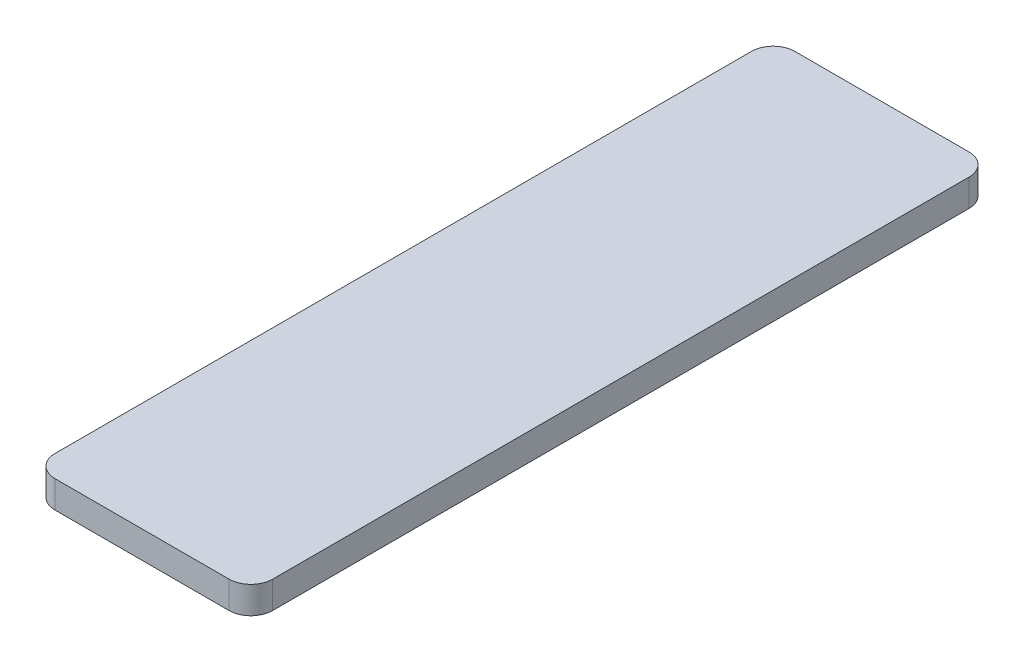
ISO-10303-21;
HEADER;
FILE_DESCRIPTION(('STEP AP214'),'2;1');
FILE_NAME('part.step','',(''),(''),'','','');
FILE_SCHEMA(('AUTOMOTIVE_DESIGN { 1 0 10303 214 1 1 1 1 }'));
ENDSEC;
DATA;
#1=APPLICATION_CONTEXT('core data for automotive mechanical design processes');
#2=APPLICATION_PROTOCOL_DEFINITION('international standard','automotive_design',2000,#1);
#3=PRODUCT_CONTEXT('',#1,'mechanical');
#4=PRODUCT('Part','Part','',(#3));
#5=PRODUCT_RELATED_PRODUCT_CATEGORY('part','',(#4));
#6=PRODUCT_DEFINITION_FORMATION('','',#4);
#7=PRODUCT_DEFINITION_CONTEXT('part definition',#1,'design');
#8=PRODUCT_DEFINITION('design','',#6,#7);
#9=PRODUCT_DEFINITION_SHAPE('','',#8);
#10=(LENGTH_UNIT() NAMED_UNIT(*) SI_UNIT(.MILLI.,.METRE.));
#11=(NAMED_UNIT(*) PLANE_ANGLE_UNIT() SI_UNIT($,.RADIAN.));
#12=(NAMED_UNIT(*) SI_UNIT($,.STERADIAN.) SOLID_ANGLE_UNIT());
#13=UNCERTAINTY_MEASURE_WITH_UNIT(LENGTH_MEASURE(1.E-05),#10,'distance_accuracy_value','');
#14=(GEOMETRIC_REPRESENTATION_CONTEXT(3) GLOBAL_UNCERTAINTY_ASSIGNED_CONTEXT((#13)) GLOBAL_UNIT_ASSIGNED_CONTEXT((#10,
#11,#12)) REPRESENTATION_CONTEXT('',''));
#15=CARTESIAN_POINT('',(0.,0.,0.));
#16=DIRECTION('',(0.,0.,1.));
#17=DIRECTION('',(1.,0.,0.));
#18=AXIS2_PLACEMENT_3D('',#15,#16,#17);
#19=CARTESIAN_POINT('',(-26.2810810810811,3.175,30.1337837837838));
#20=DIRECTION('',(1.,0.,0.));
#21=DIRECTION('',(0.,0.,-1.));
#22=AXIS2_PLACEMENT_3D('',#19,#20,#21);
#23=PLANE('',#22);
#24=DIRECTION('',(0.,0.,1.));
#25=VECTOR('',#24,1.);
#26=CARTESIAN_POINT('',(-26.2810810810811,3.175,30.1337837837838));
#27=LINE('',#26,#25);
#28=CARTESIAN_POINT('',(-26.2810810810811,3.175,-53.6762162162162));
#29=VERTEX_POINT('',#28);
#30=CARTESIAN_POINT('',(-26.2810810810811,3.175,27.5937837837838));
#31=VERTEX_POINT('',#30);
#32=EDGE_CURVE('E125',#29,#31,#27,.T.);
#33=ORIENTED_EDGE('',*,*,#32,.F.);
#34=DIRECTION('',(0.,-1.,0.));
#35=VECTOR('',#34,1.);
#36=CARTESIAN_POINT('',(-26.2810810810811,3.175,-53.6762162162162));
#37=LINE('',#36,#35);
#38=CARTESIAN_POINT('',(-26.2810810810811,0.,-53.6762162162162));
#39=VERTEX_POINT('',#38);
#40=EDGE_CURVE('E110',#29,#39,#37,.T.);
#41=ORIENTED_EDGE('',*,*,#40,.T.);
#42=DIRECTION('',(0.,0.,1.));
#43=VECTOR('',#42,1.);
#44=CARTESIAN_POINT('',(-26.2810810810811,0.,30.1337837837838));
#45=LINE('',#44,#43);
#46=CARTESIAN_POINT('',(-26.2810810810811,0.,27.5937837837838));
#47=VERTEX_POINT('',#46);
#48=EDGE_CURVE('E122',#39,#47,#45,.T.);
#49=ORIENTED_EDGE('',*,*,#48,.T.);
#50=DIRECTION('',(0.,-1.,0.));
#51=VECTOR('',#50,1.);
#52=CARTESIAN_POINT('',(-26.2810810810811,3.175,27.5937837837838));
#53=LINE('',#52,#51);
#54=EDGE_CURVE('E127',#47,#31,#53,.F.);
#55=ORIENTED_EDGE('',*,*,#54,.T.);
#56=EDGE_LOOP('',(#33,#41,#49,#55));
#57=FACE_BOUND('',#56,.T.);
#58=ADVANCED_FACE('F40',(#57),#23,.F.);
#59=CARTESIAN_POINT('',(-26.2810810810811,3.175,30.1337837837838));
#60=DIRECTION('',(0.,0.,-1.));
#61=DIRECTION('',(-1.,0.,0.));
#62=AXIS2_PLACEMENT_3D('',#59,#60,#61);
#63=PLANE('',#62);
#64=DIRECTION('',(1.,0.,0.));
#65=VECTOR('',#64,1.);
#66=CARTESIAN_POINT('',(-26.2810810810811,0.,30.1337837837838));
#67=LINE('',#66,#65);
#68=CARTESIAN_POINT('',(-23.7410810810811,0.,30.1337837837838));
#69=VERTEX_POINT('',#68);
#70=CARTESIAN_POINT('',(-3.42108108108108,0.,30.1337837837838));
#71=VERTEX_POINT('',#70);
#72=EDGE_CURVE('E131',#69,#71,#67,.T.);
#73=ORIENTED_EDGE('',*,*,#72,.T.);
#74=DIRECTION('',(0.,-1.,0.));
#75=VECTOR('',#74,1.);
#76=CARTESIAN_POINT('',(-3.42108108108108,3.175,30.1337837837838));
#77=LINE('',#76,#75);
#78=CARTESIAN_POINT('',(-3.42108108108108,3.175,30.1337837837838));
#79=VERTEX_POINT('',#78);
#80=EDGE_CURVE('E11',#71,#79,#77,.F.);
#81=ORIENTED_EDGE('',*,*,#80,.T.);
#82=DIRECTION('',(1.,0.,0.));
#83=VECTOR('',#82,1.);
#84=CARTESIAN_POINT('',(-26.2810810810811,3.175,30.1337837837838));
#85=LINE('',#84,#83);
#86=CARTESIAN_POINT('',(-23.7410810810811,3.175,30.1337837837838));
#87=VERTEX_POINT('',#86);
#88=EDGE_CURVE('E167',#87,#79,#85,.T.);
#89=ORIENTED_EDGE('',*,*,#88,.F.);
#90=DIRECTION('',(0.,-1.,0.));
#91=VECTOR('',#90,1.);
#92=CARTESIAN_POINT('',(-23.7410810810811,3.175,30.1337837837838));
#93=LINE('',#92,#91);
#94=EDGE_CURVE('E48',#87,#69,#93,.T.);
#95=ORIENTED_EDGE('',*,*,#94,.T.);
#96=EDGE_LOOP('',(#73,#81,#89,#95));
#97=FACE_BOUND('',#96,.T.);
#98=ADVANCED_FACE('F165',(#97),#63,.F.);
#99=CARTESIAN_POINT('',(-0.881081081081075,3.175,30.1337837837838));
#100=DIRECTION('',(-1.,0.,0.));
#101=DIRECTION('',(0.,0.,1.));
#102=AXIS2_PLACEMENT_3D('',#99,#100,#101);
#103=PLANE('',#102);
#104=DIRECTION('',(0.,0.,-1.));
#105=VECTOR('',#104,1.);
#106=CARTESIAN_POINT('',(-0.881081081081075,0.,30.1337837837838));
#107=LINE('',#106,#105);
#108=CARTESIAN_POINT('',(-0.881081081081075,0.,27.5937837837838));
#109=VERTEX_POINT('',#108);
#110=CARTESIAN_POINT('',(-0.881081081081078,0.,-53.6762162162162));
#111=VERTEX_POINT('',#110);
#112=EDGE_CURVE('E134',#109,#111,#107,.T.);
#113=ORIENTED_EDGE('',*,*,#112,.T.);
#114=DIRECTION('',(0.,-1.,0.));
#115=VECTOR('',#114,1.);
#116=CARTESIAN_POINT('',(-0.881081081081078,3.175,-53.6762162162162));
#117=LINE('',#116,#115);
#118=CARTESIAN_POINT('',(-0.881081081081078,3.175,-53.6762162162162));
#119=VERTEX_POINT('',#118);
#120=EDGE_CURVE('E55',#111,#119,#117,.F.);
#121=ORIENTED_EDGE('',*,*,#120,.T.);
#122=DIRECTION('',(0.,0.,-1.));
#123=VECTOR('',#122,1.);
#124=CARTESIAN_POINT('',(-0.881081081081075,3.175,30.1337837837838));
#125=LINE('',#124,#123);
#126=CARTESIAN_POINT('',(-0.881081081081075,3.175,27.5937837837838));
#127=VERTEX_POINT('',#126);
#128=EDGE_CURVE('E175',#127,#119,#125,.T.);
#129=ORIENTED_EDGE('',*,*,#128,.F.);
#130=DIRECTION('',(0.,-1.,0.));
#131=VECTOR('',#130,1.);
#132=CARTESIAN_POINT('',(-0.881081081081075,3.175,27.5937837837838));
#133=LINE('',#132,#131);
#134=EDGE_CURVE('E158',#127,#109,#133,.T.);
#135=ORIENTED_EDGE('',*,*,#134,.T.);
#136=EDGE_LOOP('',(#113,#121,#129,#135));
#137=FACE_BOUND('',#136,.T.);
#138=ADVANCED_FACE('F174',(#137),#103,.F.);
#139=CARTESIAN_POINT('',(-26.2810810810811,3.175,-56.2162162162162));
#140=DIRECTION('',(0.,0.,1.));
#141=DIRECTION('',(1.,0.,0.));
#142=AXIS2_PLACEMENT_3D('',#139,#140,#141);
#143=PLANE('',#142);
#144=DIRECTION('',(-1.,0.,0.));
#145=VECTOR('',#144,1.);
#146=CARTESIAN_POINT('',(-26.2810810810811,0.,-56.2162162162162));
#147=LINE('',#146,#145);
#148=CARTESIAN_POINT('',(-3.42108108108108,0.,-56.2162162162162));
#149=VERTEX_POINT('',#148);
#150=CARTESIAN_POINT('',(-23.7410810810811,0.,-56.2162162162162));
#151=VERTEX_POINT('',#150);
#152=EDGE_CURVE('E141',#149,#151,#147,.T.);
#153=ORIENTED_EDGE('',*,*,#152,.T.);
#154=DIRECTION('',(0.,-1.,0.));
#155=VECTOR('',#154,1.);
#156=CARTESIAN_POINT('',(-23.7410810810811,3.175,-56.2162162162162));
#157=LINE('',#156,#155);
#158=CARTESIAN_POINT('',(-23.7410810810811,3.175,-56.2162162162162));
#159=VERTEX_POINT('',#158);
#160=EDGE_CURVE('E111',#151,#159,#157,.F.);
#161=ORIENTED_EDGE('',*,*,#160,.T.);
#162=DIRECTION('',(-1.,0.,0.));
#163=VECTOR('',#162,1.);
#164=CARTESIAN_POINT('',(-26.2810810810811,3.175,-56.2162162162162));
#165=LINE('',#164,#163);
#166=CARTESIAN_POINT('',(-3.42108108108108,3.175,-56.2162162162162));
#167=VERTEX_POINT('',#166);
#168=EDGE_CURVE('E137',#167,#159,#165,.T.);
#169=ORIENTED_EDGE('',*,*,#168,.F.);
#170=DIRECTION('',(0.,-1.,0.));
#171=VECTOR('',#170,1.);
#172=CARTESIAN_POINT('',(-3.42108108108108,3.175,-56.2162162162162));
#173=LINE('',#172,#171);
#174=EDGE_CURVE('E116',#167,#149,#173,.T.);
#175=ORIENTED_EDGE('',*,*,#174,.T.);
#176=EDGE_LOOP('',(#153,#161,#169,#175));
#177=FACE_BOUND('',#176,.T.);
#178=ADVANCED_FACE('F203',(#177),#143,.F.);
#179=CARTESIAN_POINT('',(0.,3.175,0.));
#180=DIRECTION('',(0.,-1.,0.));
#181=DIRECTION('',(0.,0.,-1.));
#182=AXIS2_PLACEMENT_3D('',#179,#180,#181);
#183=PLANE('',#182);
#184=ORIENTED_EDGE('',*,*,#168,.T.);
#185=CARTESIAN_POINT('',(-23.7410810810811,3.175,-53.6762162162162));
#186=DIRECTION('',(0.,-1.,0.));
#187=DIRECTION('',(0.,0.,-1.));
#188=AXIS2_PLACEMENT_3D('',#185,#186,#187);
#189=CIRCLE('',#188,2.54);
#190=EDGE_CURVE('E156',#159,#29,#189,.F.);
#191=ORIENTED_EDGE('',*,*,#190,.T.);
#192=ORIENTED_EDGE('',*,*,#32,.T.);
#193=CARTESIAN_POINT('',(-23.7410810810811,3.175,27.5937837837838));
#194=DIRECTION('',(0.,-1.,0.));
#195=DIRECTION('',(0.,0.,-1.));
#196=AXIS2_PLACEMENT_3D('',#193,#194,#195);
#197=CIRCLE('',#196,2.54);
#198=EDGE_CURVE('E151',#31,#87,#197,.F.);
#199=ORIENTED_EDGE('',*,*,#198,.T.);
#200=ORIENTED_EDGE('',*,*,#88,.T.);
#201=CARTESIAN_POINT('',(-3.42108108108107,3.175,27.5937837837838));
#202=DIRECTION('',(0.,-1.,0.));
#203=DIRECTION('',(0.,0.,-1.));
#204=AXIS2_PLACEMENT_3D('',#201,#202,#203);
#205=CIRCLE('',#204,2.54);
#206=EDGE_CURVE('E62',#79,#127,#205,.F.);
#207=ORIENTED_EDGE('',*,*,#206,.T.);
#208=ORIENTED_EDGE('',*,*,#128,.T.);
#209=CARTESIAN_POINT('',(-3.42108108108108,3.175,-53.6762162162162));
#210=DIRECTION('',(0.,-1.,0.));
#211=DIRECTION('',(0.,0.,-1.));
#212=AXIS2_PLACEMENT_3D('',#209,#210,#211);
#213=CIRCLE('',#212,2.54);
#214=EDGE_CURVE('E154',#119,#167,#213,.F.);
#215=ORIENTED_EDGE('',*,*,#214,.T.);
#216=EDGE_LOOP('',(#184,#191,#192,#199,#200,#207,#208,#215));
#217=FACE_BOUND('',#216,.T.);
#218=ADVANCED_FACE('F180',(#217),#183,.F.);
#219=CARTESIAN_POINT('',(0.,0.,0.));
#220=DIRECTION('',(0.,-1.,0.));
#221=DIRECTION('',(0.,0.,-1.));
#222=AXIS2_PLACEMENT_3D('',#219,#220,#221);
#223=PLANE('',#222);
#224=ORIENTED_EDGE('',*,*,#48,.F.);
#225=CARTESIAN_POINT('',(-23.7410810810811,0.,-53.6762162162162));
#226=DIRECTION('',(0.,-1.,0.));
#227=DIRECTION('',(0.,0.,-1.));
#228=AXIS2_PLACEMENT_3D('',#225,#226,#227);
#229=CIRCLE('',#228,2.54);
#230=EDGE_CURVE('E106',#39,#151,#229,.T.);
#231=ORIENTED_EDGE('',*,*,#230,.T.);
#232=ORIENTED_EDGE('',*,*,#152,.F.);
#233=CARTESIAN_POINT('',(-3.42108108108108,0.,-53.6762162162162));
#234=DIRECTION('',(0.,-1.,0.));
#235=DIRECTION('',(0.,0.,-1.));
#236=AXIS2_PLACEMENT_3D('',#233,#234,#235);
#237=CIRCLE('',#236,2.54);
#238=EDGE_CURVE('E117',#149,#111,#237,.T.);
#239=ORIENTED_EDGE('',*,*,#238,.T.);
#240=ORIENTED_EDGE('',*,*,#112,.F.);
#241=CARTESIAN_POINT('',(-3.42108108108107,0.,27.5937837837838));
#242=DIRECTION('',(0.,-1.,0.));
#243=DIRECTION('',(0.,0.,-1.));
#244=AXIS2_PLACEMENT_3D('',#241,#242,#243);
#245=CIRCLE('',#244,2.54);
#246=EDGE_CURVE('E145',#109,#71,#245,.T.);
#247=ORIENTED_EDGE('',*,*,#246,.T.);
#248=ORIENTED_EDGE('',*,*,#72,.F.);
#249=CARTESIAN_POINT('',(-23.7410810810811,0.,27.5937837837838));
#250=DIRECTION('',(0.,-1.,0.));
#251=DIRECTION('',(0.,0.,-1.));
#252=AXIS2_PLACEMENT_3D('',#249,#250,#251);
#253=CIRCLE('',#252,2.54);
#254=EDGE_CURVE('E126',#69,#47,#253,.T.);
#255=ORIENTED_EDGE('',*,*,#254,.T.);
#256=EDGE_LOOP('',(#224,#231,#232,#239,#240,#247,#248,#255));
#257=FACE_BOUND('',#256,.T.);
#258=ADVANCED_FACE('F129',(#257),#223,.T.);
#259=CARTESIAN_POINT('',(-23.7410810810811,3.175,-53.6762162162162));
#260=DIRECTION('',(0.,-1.,0.));
#261=DIRECTION('',(0.,0.,-1.));
#262=AXIS2_PLACEMENT_3D('',#259,#260,#261);
#263=CYLINDRICAL_SURFACE('',#262,2.54);
#264=ORIENTED_EDGE('',*,*,#190,.F.);
#265=ORIENTED_EDGE('',*,*,#160,.F.);
#266=ORIENTED_EDGE('',*,*,#230,.F.);
#267=ORIENTED_EDGE('',*,*,#40,.F.);
#268=EDGE_LOOP('',(#264,#265,#266,#267));
#269=FACE_BOUND('',#268,.T.);
#270=ADVANCED_FACE('F109',(#269),#263,.T.);
#271=CARTESIAN_POINT('',(-3.42108108108108,3.175,-53.6762162162162));
#272=DIRECTION('',(0.,-1.,0.));
#273=DIRECTION('',(0.,0.,-1.));
#274=AXIS2_PLACEMENT_3D('',#271,#272,#273);
#275=CYLINDRICAL_SURFACE('',#274,2.54);
#276=ORIENTED_EDGE('',*,*,#214,.F.);
#277=ORIENTED_EDGE('',*,*,#120,.F.);
#278=ORIENTED_EDGE('',*,*,#238,.F.);
#279=ORIENTED_EDGE('',*,*,#174,.F.);
#280=EDGE_LOOP('',(#276,#277,#278,#279));
#281=FACE_BOUND('',#280,.T.);
#282=ADVANCED_FACE('F185',(#281),#275,.T.);
#283=CARTESIAN_POINT('',(-3.42108108108107,3.175,27.5937837837838));
#284=DIRECTION('',(0.,-1.,0.));
#285=DIRECTION('',(0.,0.,-1.));
#286=AXIS2_PLACEMENT_3D('',#283,#284,#285);
#287=CYLINDRICAL_SURFACE('',#286,2.54);
#288=ORIENTED_EDGE('',*,*,#206,.F.);
#289=ORIENTED_EDGE('',*,*,#80,.F.);
#290=ORIENTED_EDGE('',*,*,#246,.F.);
#291=ORIENTED_EDGE('',*,*,#134,.F.);
#292=EDGE_LOOP('',(#288,#289,#290,#291));
#293=FACE_BOUND('',#292,.T.);
#294=ADVANCED_FACE('F173',(#293),#287,.T.);
#295=CARTESIAN_POINT('',(-23.7410810810811,3.175,27.5937837837838));
#296=DIRECTION('',(0.,-1.,0.));
#297=DIRECTION('',(0.,0.,-1.));
#298=AXIS2_PLACEMENT_3D('',#295,#296,#297);
#299=CYLINDRICAL_SURFACE('',#298,2.54);
#300=ORIENTED_EDGE('',*,*,#198,.F.);
#301=ORIENTED_EDGE('',*,*,#54,.F.);
#302=ORIENTED_EDGE('',*,*,#254,.F.);
#303=ORIENTED_EDGE('',*,*,#94,.F.);
#304=EDGE_LOOP('',(#300,#301,#302,#303));
#305=FACE_BOUND('',#304,.T.);
#306=ADVANCED_FACE('F42',(#305),#299,.T.);
#307=CLOSED_SHELL('',(#58,#98,#138,#178,#218,#258,#270,#282,#294,#306));
#308=MANIFOLD_SOLID_BREP('B2',#307);
#309=ADVANCED_BREP_SHAPE_REPRESENTATION('',(#18,#308),#14);
#310=SHAPE_DEFINITION_REPRESENTATION(#9,#309);
ENDSEC;
END-ISO-10303-21;
